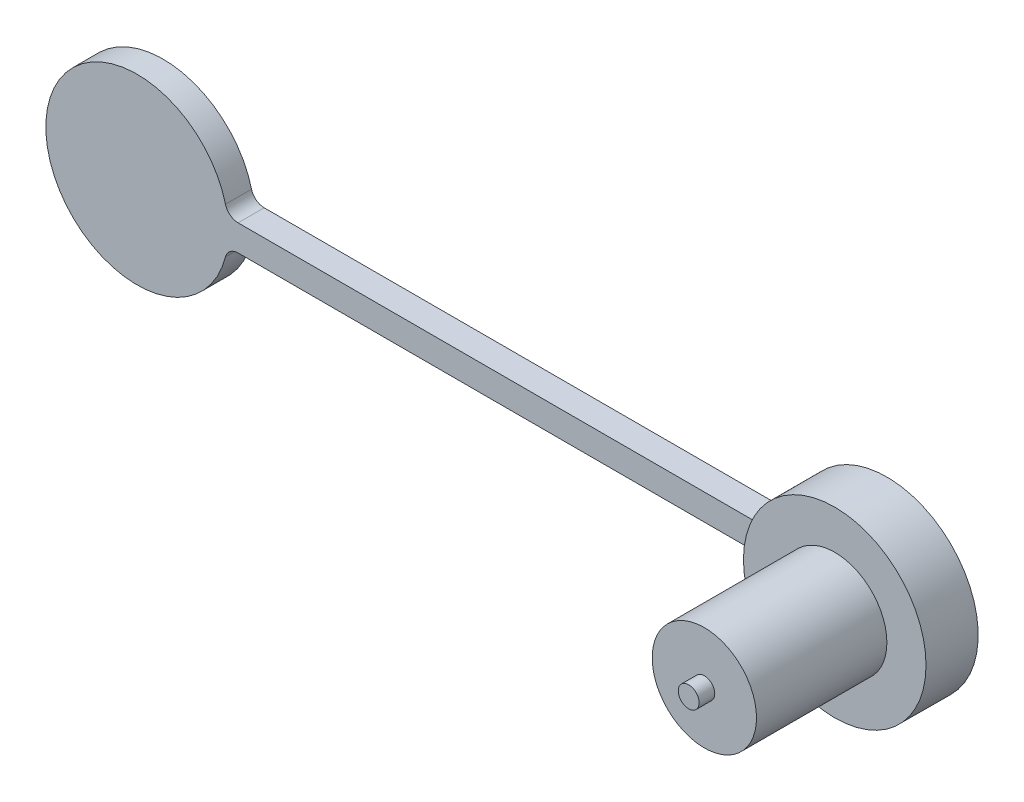
ISO-10303-21;
HEADER;
FILE_DESCRIPTION(('STEP AP214'),'2;1');
FILE_NAME('part.step','',(''),(''),'','','');
FILE_SCHEMA(('AUTOMOTIVE_DESIGN { 1 0 10303 214 1 1 1 1 }'));
ENDSEC;
DATA;
#1=APPLICATION_CONTEXT('core data for automotive mechanical design processes');
#2=APPLICATION_PROTOCOL_DEFINITION('international standard','automotive_design',2000,#1);
#3=PRODUCT_CONTEXT('',#1,'mechanical');
#4=PRODUCT('Part','Part','',(#3));
#5=PRODUCT_RELATED_PRODUCT_CATEGORY('part','',(#4));
#6=PRODUCT_DEFINITION_FORMATION('','',#4);
#7=PRODUCT_DEFINITION_CONTEXT('part definition',#1,'design');
#8=PRODUCT_DEFINITION('design','',#6,#7);
#9=PRODUCT_DEFINITION_SHAPE('','',#8);
#10=(LENGTH_UNIT() NAMED_UNIT(*) SI_UNIT(.MILLI.,.METRE.));
#11=(NAMED_UNIT(*) PLANE_ANGLE_UNIT() SI_UNIT($,.RADIAN.));
#12=(NAMED_UNIT(*) SI_UNIT($,.STERADIAN.) SOLID_ANGLE_UNIT());
#13=UNCERTAINTY_MEASURE_WITH_UNIT(LENGTH_MEASURE(1.E-05),#10,'distance_accuracy_value','');
#14=(GEOMETRIC_REPRESENTATION_CONTEXT(3) GLOBAL_UNCERTAINTY_ASSIGNED_CONTEXT((#13)) GLOBAL_UNIT_ASSIGNED_CONTEXT((#10,
#11,#12)) REPRESENTATION_CONTEXT('',''));
#15=CARTESIAN_POINT('',(0.,0.,0.));
#16=DIRECTION('',(0.,0.,1.));
#17=DIRECTION('',(1.,0.,0.));
#18=AXIS2_PLACEMENT_3D('',#15,#16,#17);
#19=CARTESIAN_POINT('',(277.5,0.,76.));
#20=DIRECTION('',(0.,0.,-1.));
#21=DIRECTION('',(-1.,0.,0.));
#22=AXIS2_PLACEMENT_3D('',#19,#20,#21);
#23=CYLINDRICAL_SURFACE('',#22,4.);
#24=CARTESIAN_POINT('',(277.5,0.,76.));
#25=DIRECTION('',(0.,0.,1.));
#26=DIRECTION('',(1.,0.,0.));
#27=AXIS2_PLACEMENT_3D('',#24,#25,#26);
#28=CIRCLE('',#27,4.);
#29=CARTESIAN_POINT('',(281.5,0.,76.));
#30=VERTEX_POINT('',#29);
#31=EDGE_CURVE('E11',#30,#30,#28,.T.);
#32=ORIENTED_EDGE('',*,*,#31,.F.);
#33=EDGE_LOOP('',(#32));
#34=FACE_BOUND('',#33,.T.);
#35=CARTESIAN_POINT('',(277.5,0.,70.));
#36=DIRECTION('',(0.,0.,1.));
#37=DIRECTION('',(1.,0.,0.));
#38=AXIS2_PLACEMENT_3D('',#35,#36,#37);
#39=CIRCLE('',#38,4.);
#40=CARTESIAN_POINT('',(281.5,0.,70.));
#41=VERTEX_POINT('',#40);
#42=EDGE_CURVE('E56',#41,#41,#39,.T.);
#43=ORIENTED_EDGE('',*,*,#42,.T.);
#44=EDGE_LOOP('',(#43));
#45=FACE_BOUND('',#44,.T.);
#46=ADVANCED_FACE('F53',(#34,#45),#23,.T.);
#47=CARTESIAN_POINT('',(277.5,0.,76.));
#48=DIRECTION('',(0.,0.,1.));
#49=DIRECTION('',(1.,0.,0.));
#50=AXIS2_PLACEMENT_3D('',#47,#48,#49);
#51=PLANE('',#50);
#52=ORIENTED_EDGE('',*,*,#31,.T.);
#53=EDGE_LOOP('',(#52));
#54=FACE_BOUND('',#53,.T.);
#55=ADVANCED_FACE('F68',(#54),#51,.T.);
#56=CARTESIAN_POINT('',(277.5,0.,70.));
#57=DIRECTION('',(0.,0.,1.));
#58=DIRECTION('',(1.,0.,0.));
#59=AXIS2_PLACEMENT_3D('',#56,#57,#58);
#60=PLANE('',#59);
#61=ORIENTED_EDGE('',*,*,#42,.F.);
#62=EDGE_LOOP('',(#61));
#63=FACE_BOUND('',#62,.T.);
#64=ADVANCED_FACE('F66',(#63),#60,.F.);
#65=CLOSED_SHELL('',(#46,#55,#64));
#66=MANIFOLD_SOLID_BREP('B2',#65);
#67=CARTESIAN_POINT('',(277.5,4.99999999999999,10.));
#68=DIRECTION('',(0.,-1.,0.));
#69=DIRECTION('',(0.,0.,-1.));
#70=AXIS2_PLACEMENT_3D('',#67,#68,#69);
#71=PLANE('',#70);
#72=DIRECTION('',(-1.,0.,0.));
#73=VECTOR('',#72,1.);
#74=CARTESIAN_POINT('',(277.5,4.99999999999999,10.));
#75=LINE('',#74,#73);
#76=CARTESIAN_POINT('',(238.770166537926,4.99999999999999,10.));
#77=VERTEX_POINT('',#76);
#78=CARTESIAN_POINT('',(38.7298334620742,4.99999999999999,10.));
#79=VERTEX_POINT('',#78);
#80=EDGE_CURVE('E172',#77,#79,#75,.T.);
#81=ORIENTED_EDGE('',*,*,#80,.F.);
#82=DIRECTION('',(0.,0.,1.));
#83=VECTOR('',#82,1.);
#84=CARTESIAN_POINT('',(238.770166537926,4.99999999999999,0.));
#85=LINE('',#84,#83);
#86=CARTESIAN_POINT('',(238.770166537926,4.99999999999999,0.));
#87=VERTEX_POINT('',#86);
#88=EDGE_CURVE('E118',#77,#87,#85,.F.);
#89=ORIENTED_EDGE('',*,*,#88,.T.);
#90=DIRECTION('',(-1.,0.,0.));
#91=VECTOR('',#90,1.);
#92=CARTESIAN_POINT('',(277.5,4.99999999999999,0.));
#93=LINE('',#92,#91);
#94=CARTESIAN_POINT('',(38.7298334620742,4.99999999999999,0.));
#95=VERTEX_POINT('',#94);
#96=EDGE_CURVE('E240',#87,#95,#93,.T.);
#97=ORIENTED_EDGE('',*,*,#96,.T.);
#98=DIRECTION('',(0.,0.,1.));
#99=VECTOR('',#98,1.);
#100=CARTESIAN_POINT('',(38.7298334620742,4.99999999999999,10.));
#101=LINE('',#100,#99);
#102=EDGE_CURVE('E184',#95,#79,#101,.T.);
#103=ORIENTED_EDGE('',*,*,#102,.T.);
#104=EDGE_LOOP('',(#81,#89,#97,#103));
#105=FACE_BOUND('',#104,.T.);
#106=ADVANCED_FACE('F94',(#105),#71,.F.);
#107=CARTESIAN_POINT('',(277.5,-5.00000000000001,10.));
#108=DIRECTION('',(0.,1.,0.));
#109=DIRECTION('',(0.,0.,1.));
#110=AXIS2_PLACEMENT_3D('',#107,#108,#109);
#111=PLANE('',#110);
#112=DIRECTION('',(-1.,0.,0.));
#113=VECTOR('',#112,1.);
#114=CARTESIAN_POINT('',(277.5,-5.00000000000001,0.));
#115=LINE('',#114,#113);
#116=CARTESIAN_POINT('',(238.770166537926,-5.00000000000001,0.));
#117=VERTEX_POINT('',#116);
#118=CARTESIAN_POINT('',(38.7298334620742,-5.00000000000001,0.));
#119=VERTEX_POINT('',#118);
#120=EDGE_CURVE('E173',#117,#119,#115,.T.);
#121=ORIENTED_EDGE('',*,*,#120,.F.);
#122=DIRECTION('',(0.,0.,1.));
#123=VECTOR('',#122,1.);
#124=CARTESIAN_POINT('',(238.770166537926,-5.00000000000001,10.));
#125=LINE('',#124,#123);
#126=CARTESIAN_POINT('',(238.770166537926,-5.00000000000001,10.));
#127=VERTEX_POINT('',#126);
#128=EDGE_CURVE('E168',#117,#127,#125,.T.);
#129=ORIENTED_EDGE('',*,*,#128,.T.);
#130=DIRECTION('',(-1.,0.,0.));
#131=VECTOR('',#130,1.);
#132=CARTESIAN_POINT('',(277.5,-5.00000000000001,10.));
#133=LINE('',#132,#131);
#134=CARTESIAN_POINT('',(38.7298334620742,-5.00000000000001,10.));
#135=VERTEX_POINT('',#134);
#136=EDGE_CURVE('E161',#127,#135,#133,.T.);
#137=ORIENTED_EDGE('',*,*,#136,.T.);
#138=DIRECTION('',(0.,0.,1.));
#139=VECTOR('',#138,1.);
#140=CARTESIAN_POINT('',(38.7298334620742,-5.00000000000001,0.));
#141=LINE('',#140,#139);
#142=EDGE_CURVE('E166',#135,#119,#141,.F.);
#143=ORIENTED_EDGE('',*,*,#142,.T.);
#144=EDGE_LOOP('',(#121,#129,#137,#143));
#145=FACE_BOUND('',#144,.T.);
#146=ADVANCED_FACE('F164',(#145),#111,.F.);
#147=CARTESIAN_POINT('',(0.,0.,10.));
#148=DIRECTION('',(0.,0.,-1.));
#149=DIRECTION('',(-1.,0.,0.));
#150=AXIS2_PLACEMENT_3D('',#147,#148,#149);
#151=CYLINDRICAL_SURFACE('',#150,35.);
#152=CARTESIAN_POINT('',(0.,0.,10.));
#153=DIRECTION('',(0.,0.,1.));
#154=DIRECTION('',(1.,0.,0.));
#155=AXIS2_PLACEMENT_3D('',#152,#153,#154);
#156=CIRCLE('',#155,35.);
#157=CARTESIAN_POINT('',(33.8886042793149,8.74999999999999,10.));
#158=VERTEX_POINT('',#157);
#159=CARTESIAN_POINT('',(33.8886042793149,-8.75000000000001,10.));
#160=VERTEX_POINT('',#159);
#161=EDGE_CURVE('E179',#158,#160,#156,.T.);
#162=ORIENTED_EDGE('',*,*,#161,.F.);
#163=DIRECTION('',(0.,0.,-1.));
#164=VECTOR('',#163,1.);
#165=CARTESIAN_POINT('',(33.8886042793149,8.75,10.));
#166=LINE('',#165,#164);
#167=CARTESIAN_POINT('',(33.8886042793149,8.74999999999999,0.));
#168=VERTEX_POINT('',#167);
#169=EDGE_CURVE('E205',#158,#168,#166,.T.);
#170=ORIENTED_EDGE('',*,*,#169,.T.);
#171=CARTESIAN_POINT('',(0.,0.,0.));
#172=DIRECTION('',(0.,0.,1.));
#173=DIRECTION('',(1.,0.,0.));
#174=AXIS2_PLACEMENT_3D('',#171,#172,#173);
#175=CIRCLE('',#174,35.);
#176=CARTESIAN_POINT('',(33.8886042793149,-8.75000000000001,0.));
#177=VERTEX_POINT('',#176);
#178=EDGE_CURVE('E196',#168,#177,#175,.T.);
#179=ORIENTED_EDGE('',*,*,#178,.T.);
#180=DIRECTION('',(0.,0.,-1.));
#181=VECTOR('',#180,1.);
#182=CARTESIAN_POINT('',(33.8886042793149,-8.75000000000001,10.));
#183=LINE('',#182,#181);
#184=EDGE_CURVE('E191',#177,#160,#183,.F.);
#185=ORIENTED_EDGE('',*,*,#184,.T.);
#186=EDGE_LOOP('',(#162,#170,#179,#185));
#187=FACE_BOUND('',#186,.T.);
#188=ADVANCED_FACE('F270',(#187),#151,.T.);
#189=CARTESIAN_POINT('',(0.,0.,10.));
#190=DIRECTION('',(0.,0.,1.));
#191=DIRECTION('',(1.,0.,0.));
#192=AXIS2_PLACEMENT_3D('',#189,#190,#191);
#193=PLANE('',#192);
#194=ORIENTED_EDGE('',*,*,#136,.F.);
#195=CARTESIAN_POINT('',(238.770166537926,-10.,10.));
#196=DIRECTION('',(0.,0.,1.));
#197=DIRECTION('',(1.,0.,0.));
#198=AXIS2_PLACEMENT_3D('',#195,#196,#197);
#199=CIRCLE('',#198,5.);
#200=CARTESIAN_POINT('',(243.611395720685,-8.75000000000001,10.));
#201=VERTEX_POINT('',#200);
#202=EDGE_CURVE('E224',#127,#201,#199,.F.);
#203=ORIENTED_EDGE('',*,*,#202,.T.);
#204=CARTESIAN_POINT('',(277.5,0.,10.));
#205=DIRECTION('',(0.,0.,1.));
#206=DIRECTION('',(1.,0.,0.));
#207=AXIS2_PLACEMENT_3D('',#204,#205,#206);
#208=CIRCLE('',#207,35.);
#209=CARTESIAN_POINT('',(243.611395720685,8.74999999999999,10.));
#210=VERTEX_POINT('',#209);
#211=EDGE_CURVE('E301',#201,#210,#208,.F.);
#212=ORIENTED_EDGE('',*,*,#211,.T.);
#213=CARTESIAN_POINT('',(238.770166537926,9.99999999999999,10.));
#214=DIRECTION('',(0.,0.,1.));
#215=DIRECTION('',(1.,0.,0.));
#216=AXIS2_PLACEMENT_3D('',#213,#214,#215);
#217=CIRCLE('',#216,5.);
#218=EDGE_CURVE('E111',#210,#77,#217,.F.);
#219=ORIENTED_EDGE('',*,*,#218,.T.);
#220=ORIENTED_EDGE('',*,*,#80,.T.);
#221=CARTESIAN_POINT('',(38.7298334620742,9.99999999999999,10.));
#222=DIRECTION('',(0.,0.,1.));
#223=DIRECTION('',(1.,0.,0.));
#224=AXIS2_PLACEMENT_3D('',#221,#222,#223);
#225=CIRCLE('',#224,5.);
#226=EDGE_CURVE('E208',#79,#158,#225,.F.);
#227=ORIENTED_EDGE('',*,*,#226,.T.);
#228=ORIENTED_EDGE('',*,*,#161,.T.);
#229=CARTESIAN_POINT('',(38.7298334620742,-10.,10.));
#230=DIRECTION('',(0.,0.,1.));
#231=DIRECTION('',(1.,0.,0.));
#232=AXIS2_PLACEMENT_3D('',#229,#230,#231);
#233=CIRCLE('',#232,5.);
#234=EDGE_CURVE('E176',#160,#135,#233,.F.);
#235=ORIENTED_EDGE('',*,*,#234,.T.);
#236=EDGE_LOOP('',(#194,#203,#212,#219,#220,#227,#228,#235));
#237=FACE_BOUND('',#236,.T.);
#238=ADVANCED_FACE('F177',(#237),#193,.T.);
#239=CARTESIAN_POINT('',(0.,0.,0.));
#240=DIRECTION('',(0.,0.,1.));
#241=DIRECTION('',(1.,0.,0.));
#242=AXIS2_PLACEMENT_3D('',#239,#240,#241);
#243=PLANE('',#242);
#244=ORIENTED_EDGE('',*,*,#96,.F.);
#245=CARTESIAN_POINT('',(238.770166537926,9.99999999999999,0.));
#246=DIRECTION('',(0.,0.,1.));
#247=DIRECTION('',(1.,0.,0.));
#248=AXIS2_PLACEMENT_3D('',#245,#246,#247);
#249=CIRCLE('',#248,5.);
#250=CARTESIAN_POINT('',(243.611395720685,8.74999999999999,0.));
#251=VERTEX_POINT('',#250);
#252=EDGE_CURVE('E98',#87,#251,#249,.T.);
#253=ORIENTED_EDGE('',*,*,#252,.T.);
#254=CARTESIAN_POINT('',(277.5,0.,0.));
#255=DIRECTION('',(0.,0.,1.));
#256=DIRECTION('',(1.,0.,0.));
#257=AXIS2_PLACEMENT_3D('',#254,#255,#256);
#258=CIRCLE('',#257,35.);
#259=CARTESIAN_POINT('',(243.611395720685,-8.75000000000001,0.));
#260=VERTEX_POINT('',#259);
#261=EDGE_CURVE('E239',#260,#251,#258,.T.);
#262=ORIENTED_EDGE('',*,*,#261,.F.);
#263=CARTESIAN_POINT('',(238.770166537926,-10.,0.));
#264=DIRECTION('',(0.,0.,1.));
#265=DIRECTION('',(1.,0.,0.));
#266=AXIS2_PLACEMENT_3D('',#263,#264,#265);
#267=CIRCLE('',#266,5.);
#268=EDGE_CURVE('E221',#260,#117,#267,.T.);
#269=ORIENTED_EDGE('',*,*,#268,.T.);
#270=ORIENTED_EDGE('',*,*,#120,.T.);
#271=CARTESIAN_POINT('',(38.7298334620742,-10.,0.));
#272=DIRECTION('',(0.,0.,1.));
#273=DIRECTION('',(1.,0.,0.));
#274=AXIS2_PLACEMENT_3D('',#271,#272,#273);
#275=CIRCLE('',#274,5.);
#276=EDGE_CURVE('E185',#119,#177,#275,.T.);
#277=ORIENTED_EDGE('',*,*,#276,.T.);
#278=ORIENTED_EDGE('',*,*,#178,.F.);
#279=CARTESIAN_POINT('',(38.7298334620742,9.99999999999999,0.));
#280=DIRECTION('',(0.,0.,1.));
#281=DIRECTION('',(1.,0.,0.));
#282=AXIS2_PLACEMENT_3D('',#279,#280,#281);
#283=CIRCLE('',#282,5.);
#284=EDGE_CURVE('E211',#168,#95,#283,.T.);
#285=ORIENTED_EDGE('',*,*,#284,.T.);
#286=EDGE_LOOP('',(#244,#253,#262,#269,#270,#277,#278,#285));
#287=FACE_BOUND('',#286,.T.);
#288=ADVANCED_FACE('F238',(#287),#243,.F.);
#289=CARTESIAN_POINT('',(38.7298334620742,-10.,10.));
#290=DIRECTION('',(0.,0.,-1.));
#291=DIRECTION('',(-1.,0.,0.));
#292=AXIS2_PLACEMENT_3D('',#289,#290,#291);
#293=CYLINDRICAL_SURFACE('',#292,5.);
#294=ORIENTED_EDGE('',*,*,#234,.F.);
#295=ORIENTED_EDGE('',*,*,#184,.F.);
#296=ORIENTED_EDGE('',*,*,#276,.F.);
#297=ORIENTED_EDGE('',*,*,#142,.F.);
#298=EDGE_LOOP('',(#294,#295,#296,#297));
#299=FACE_BOUND('',#298,.T.);
#300=ADVANCED_FACE('F188',(#299),#293,.F.);
#301=CARTESIAN_POINT('',(38.7298334620742,9.99999999999999,10.));
#302=DIRECTION('',(0.,0.,-1.));
#303=DIRECTION('',(-1.,0.,0.));
#304=AXIS2_PLACEMENT_3D('',#301,#302,#303);
#305=CYLINDRICAL_SURFACE('',#304,5.);
#306=ORIENTED_EDGE('',*,*,#284,.F.);
#307=ORIENTED_EDGE('',*,*,#169,.F.);
#308=ORIENTED_EDGE('',*,*,#226,.F.);
#309=ORIENTED_EDGE('',*,*,#102,.F.);
#310=EDGE_LOOP('',(#306,#307,#308,#309));
#311=FACE_BOUND('',#310,.T.);
#312=ADVANCED_FACE('F282',(#311),#305,.F.);
#313=CARTESIAN_POINT('',(277.5,0.,20.));
#314=DIRECTION('',(0.,0.,-1.));
#315=DIRECTION('',(-1.,0.,0.));
#316=AXIS2_PLACEMENT_3D('',#313,#314,#315);
#317=CYLINDRICAL_SURFACE('',#316,35.);
#318=CARTESIAN_POINT('',(277.5,0.,20.));
#319=DIRECTION('',(0.,0.,1.));
#320=DIRECTION('',(1.,0.,0.));
#321=AXIS2_PLACEMENT_3D('',#318,#319,#320);
#322=CIRCLE('',#321,35.);
#323=CARTESIAN_POINT('',(312.5,0.,20.));
#324=VERTEX_POINT('',#323);
#325=EDGE_CURVE('E247',#324,#324,#322,.T.);
#326=ORIENTED_EDGE('',*,*,#325,.F.);
#327=EDGE_LOOP('',(#326));
#328=FACE_BOUND('',#327,.T.);
#329=ORIENTED_EDGE('',*,*,#261,.T.);
#330=DIRECTION('',(0.,0.,-1.));
#331=VECTOR('',#330,1.);
#332=CARTESIAN_POINT('',(243.611395720685,8.75,20.));
#333=LINE('',#332,#331);
#334=EDGE_CURVE('E227',#251,#210,#333,.F.);
#335=ORIENTED_EDGE('',*,*,#334,.T.);
#336=ORIENTED_EDGE('',*,*,#211,.F.);
#337=DIRECTION('',(0.,0.,-1.));
#338=VECTOR('',#337,1.);
#339=CARTESIAN_POINT('',(243.611395720685,-8.75000000000001,20.));
#340=LINE('',#339,#338);
#341=EDGE_CURVE('E215',#201,#260,#340,.T.);
#342=ORIENTED_EDGE('',*,*,#341,.T.);
#343=EDGE_LOOP('',(#329,#335,#336,#342));
#344=FACE_BOUND('',#343,.T.);
#345=ADVANCED_FACE('F244',(#328,#344),#317,.T.);
#346=CARTESIAN_POINT('',(277.5,0.,20.));
#347=DIRECTION('',(0.,0.,1.));
#348=DIRECTION('',(1.,0.,0.));
#349=AXIS2_PLACEMENT_3D('',#346,#347,#348);
#350=PLANE('',#349);
#351=CARTESIAN_POINT('',(277.5,0.,20.));
#352=DIRECTION('',(0.,0.,1.));
#353=DIRECTION('',(1.,0.,0.));
#354=AXIS2_PLACEMENT_3D('',#351,#352,#353);
#355=CIRCLE('',#354,20.);
#356=CARTESIAN_POINT('',(297.5,0.,20.));
#357=VERTEX_POINT('',#356);
#358=EDGE_CURVE('E51',#357,#357,#355,.T.);
#359=ORIENTED_EDGE('',*,*,#358,.F.);
#360=EDGE_LOOP('',(#359));
#361=FACE_BOUND('',#360,.T.);
#362=ORIENTED_EDGE('',*,*,#325,.T.);
#363=EDGE_LOOP('',(#362));
#364=FACE_BOUND('',#363,.T.);
#365=ADVANCED_FACE('F262',(#361,#364),#350,.T.);
#366=CARTESIAN_POINT('',(238.770166537926,-10.,20.));
#367=DIRECTION('',(0.,0.,-1.));
#368=DIRECTION('',(-1.,0.,0.));
#369=AXIS2_PLACEMENT_3D('',#366,#367,#368);
#370=CYLINDRICAL_SURFACE('',#369,5.);
#371=ORIENTED_EDGE('',*,*,#202,.F.);
#372=ORIENTED_EDGE('',*,*,#128,.F.);
#373=ORIENTED_EDGE('',*,*,#268,.F.);
#374=ORIENTED_EDGE('',*,*,#341,.F.);
#375=EDGE_LOOP('',(#371,#372,#373,#374));
#376=FACE_BOUND('',#375,.T.);
#377=ADVANCED_FACE('F252',(#376),#370,.F.);
#378=CARTESIAN_POINT('',(238.770166537926,9.99999999999999,20.));
#379=DIRECTION('',(0.,0.,-1.));
#380=DIRECTION('',(-1.,0.,0.));
#381=AXIS2_PLACEMENT_3D('',#378,#379,#380);
#382=CYLINDRICAL_SURFACE('',#381,5.);
#383=ORIENTED_EDGE('',*,*,#252,.F.);
#384=ORIENTED_EDGE('',*,*,#88,.F.);
#385=ORIENTED_EDGE('',*,*,#218,.F.);
#386=ORIENTED_EDGE('',*,*,#334,.F.);
#387=EDGE_LOOP('',(#383,#384,#385,#386));
#388=FACE_BOUND('',#387,.T.);
#389=ADVANCED_FACE('F96',(#388),#382,.F.);
#390=CARTESIAN_POINT('',(277.5,0.,70.));
#391=DIRECTION('',(0.,0.,-1.));
#392=DIRECTION('',(-1.,0.,0.));
#393=AXIS2_PLACEMENT_3D('',#390,#391,#392);
#394=CYLINDRICAL_SURFACE('',#393,20.);
#395=CARTESIAN_POINT('',(277.5,0.,70.));
#396=DIRECTION('',(0.,0.,1.));
#397=DIRECTION('',(1.,0.,0.));
#398=AXIS2_PLACEMENT_3D('',#395,#396,#397);
#399=CIRCLE('',#398,20.);
#400=CARTESIAN_POINT('',(297.5,0.,70.));
#401=VERTEX_POINT('',#400);
#402=EDGE_CURVE('E248',#401,#401,#399,.T.);
#403=ORIENTED_EDGE('',*,*,#402,.F.);
#404=EDGE_LOOP('',(#403));
#405=FACE_BOUND('',#404,.T.);
#406=ORIENTED_EDGE('',*,*,#358,.T.);
#407=EDGE_LOOP('',(#406));
#408=FACE_BOUND('',#407,.T.);
#409=ADVANCED_FACE('F251',(#405,#408),#394,.T.);
#410=CARTESIAN_POINT('',(277.5,0.,70.));
#411=DIRECTION('',(0.,0.,1.));
#412=DIRECTION('',(1.,0.,0.));
#413=AXIS2_PLACEMENT_3D('',#410,#411,#412);
#414=PLANE('',#413);
#415=ORIENTED_EDGE('',*,*,#402,.T.);
#416=EDGE_LOOP('',(#415));
#417=FACE_BOUND('',#416,.T.);
#418=ADVANCED_FACE('F258',(#417),#414,.T.);
#419=CLOSED_SHELL('',(#106,#146,#188,#238,#288,#300,#312,#345,#365,#377,#389,#409,#418));
#420=MANIFOLD_SOLID_BREP('B6',#419);
#421=ADVANCED_BREP_SHAPE_REPRESENTATION('',(#18,#66,#420),#14);
#422=SHAPE_DEFINITION_REPRESENTATION(#9,#421);
ENDSEC;
END-ISO-10303-21;
